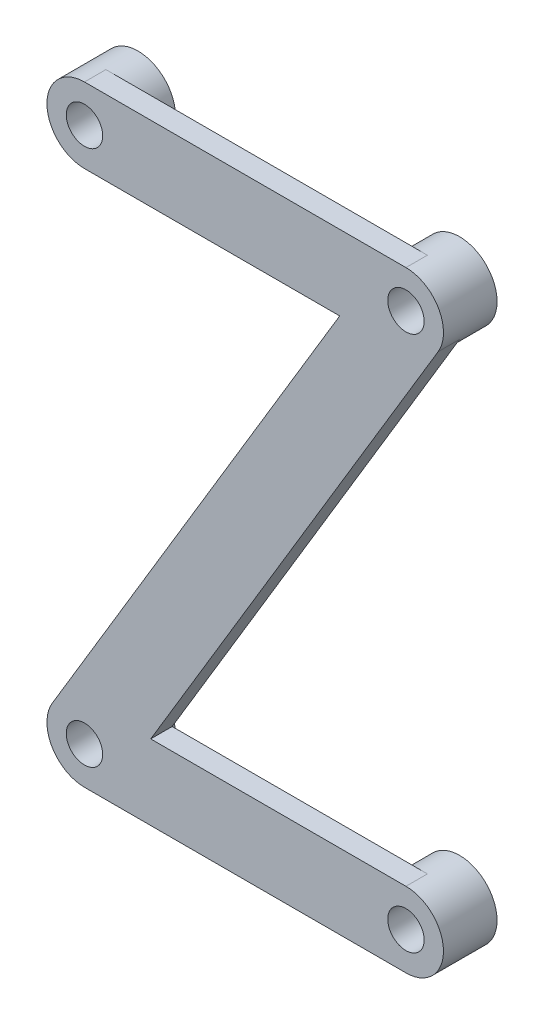
ISO-10303-21;
HEADER;
FILE_DESCRIPTION(('STEP AP214'),'2;1');
FILE_NAME('part.step','',(''),(''),'','','');
FILE_SCHEMA(('AUTOMOTIVE_DESIGN { 1 0 10303 214 1 1 1 1 }'));
ENDSEC;
DATA;
#1=APPLICATION_CONTEXT('core data for automotive mechanical design processes');
#2=APPLICATION_PROTOCOL_DEFINITION('international standard','automotive_design',2000,#1);
#3=PRODUCT_CONTEXT('',#1,'mechanical');
#4=PRODUCT('Part','Part','',(#3));
#5=PRODUCT_RELATED_PRODUCT_CATEGORY('part','',(#4));
#6=PRODUCT_DEFINITION_FORMATION('','',#4);
#7=PRODUCT_DEFINITION_CONTEXT('part definition',#1,'design');
#8=PRODUCT_DEFINITION('design','',#6,#7);
#9=PRODUCT_DEFINITION_SHAPE('','',#8);
#10=(LENGTH_UNIT() NAMED_UNIT(*) SI_UNIT(.MILLI.,.METRE.));
#11=(NAMED_UNIT(*) PLANE_ANGLE_UNIT() SI_UNIT($,.RADIAN.));
#12=(NAMED_UNIT(*) SI_UNIT($,.STERADIAN.) SOLID_ANGLE_UNIT());
#13=UNCERTAINTY_MEASURE_WITH_UNIT(LENGTH_MEASURE(1.E-05),#10,'distance_accuracy_value','');
#14=(GEOMETRIC_REPRESENTATION_CONTEXT(3) GLOBAL_UNCERTAINTY_ASSIGNED_CONTEXT((#13)) GLOBAL_UNIT_ASSIGNED_CONTEXT((#10,
#11,#12)) REPRESENTATION_CONTEXT('',''));
#15=CARTESIAN_POINT('',(0.,0.,0.));
#16=DIRECTION('',(0.,0.,1.));
#17=DIRECTION('',(1.,0.,0.));
#18=AXIS2_PLACEMENT_3D('',#15,#16,#17);
#19=CARTESIAN_POINT('',(0.,28.5,-2.));
#20=DIRECTION('',(0.,-1.,0.));
#21=DIRECTION('',(1.,0.,0.));
#22=AXIS2_PLACEMENT_3D('',#19,#20,#21);
#23=PLANE('',#22);
#24=DIRECTION('',(1.,0.,0.));
#25=VECTOR('',#24,1.);
#26=CARTESIAN_POINT('',(0.,28.5,0.));
#27=LINE('',#26,#25);
#28=CARTESIAN_POINT('',(-15.,28.5,0.));
#29=VERTEX_POINT('',#28);
#30=CARTESIAN_POINT('',(15.,28.5,0.));
#31=VERTEX_POINT('',#30);
#32=EDGE_CURVE('E84',#29,#31,#27,.T.);
#33=ORIENTED_EDGE('',*,*,#32,.T.);
#34=DIRECTION('',(0.,0.,1.));
#35=VECTOR('',#34,1.);
#36=CARTESIAN_POINT('',(15.,28.5,-2.));
#37=LINE('',#36,#35);
#38=CARTESIAN_POINT('',(15.,28.5,-2.));
#39=VERTEX_POINT('',#38);
#40=EDGE_CURVE('E47',#39,#31,#37,.T.);
#41=ORIENTED_EDGE('',*,*,#40,.F.);
#42=DIRECTION('',(1.,0.,0.));
#43=VECTOR('',#42,1.);
#44=CARTESIAN_POINT('',(0.,28.5,-2.));
#45=LINE('',#44,#43);
#46=CARTESIAN_POINT('',(-15.,28.5,-2.));
#47=VERTEX_POINT('',#46);
#48=EDGE_CURVE('E55',#47,#39,#45,.T.);
#49=ORIENTED_EDGE('',*,*,#48,.F.);
#50=DIRECTION('',(0.,0.,1.));
#51=VECTOR('',#50,1.);
#52=CARTESIAN_POINT('',(-15.,28.5,-2.));
#53=LINE('',#52,#51);
#54=EDGE_CURVE('E11',#47,#29,#53,.T.);
#55=ORIENTED_EDGE('',*,*,#54,.T.);
#56=EDGE_LOOP('',(#33,#41,#49,#55));
#57=FACE_BOUND('',#56,.T.);
#58=ADVANCED_FACE('F37',(#57),#23,.F.);
#59=CARTESIAN_POINT('',(3.00122523999391,-1.80073514399634,-2.));
#60=DIRECTION('',(-0.857492925712545,0.514495755427526,0.));
#61=DIRECTION('',(-0.514495755427526,-0.857492925712545,0.));
#62=AXIS2_PLACEMENT_3D('',#59,#60,#61);
#63=PLANE('',#62);
#64=DIRECTION('',(-0.514495755427526,-0.857492925712545,0.));
#65=VECTOR('',#64,1.);
#66=CARTESIAN_POINT('',(3.00122523999391,-1.80073514399634,0.));
#67=LINE('',#66,#65);
#68=CARTESIAN_POINT('',(18.0012252399939,23.1992648560037,0.));
#69=VERTEX_POINT('',#68);
#70=CARTESIAN_POINT('',(-8.81833367360827,-21.5,0.));
#71=VERTEX_POINT('',#70);
#72=EDGE_CURVE('E79',#69,#71,#67,.T.);
#73=ORIENTED_EDGE('',*,*,#72,.T.);
#74=DIRECTION('',(0.,0.,1.));
#75=VECTOR('',#74,1.);
#76=CARTESIAN_POINT('',(-8.81833367360827,-21.5,-2.));
#77=LINE('',#76,#75);
#78=CARTESIAN_POINT('',(-8.81833367360827,-21.5,-2.));
#79=VERTEX_POINT('',#78);
#80=EDGE_CURVE('E126',#79,#71,#77,.T.);
#81=ORIENTED_EDGE('',*,*,#80,.F.);
#82=DIRECTION('',(-0.514495755427526,-0.857492925712545,0.));
#83=VECTOR('',#82,1.);
#84=CARTESIAN_POINT('',(3.00122523999391,-1.80073514399634,-2.));
#85=LINE('',#84,#83);
#86=CARTESIAN_POINT('',(18.0012252399939,23.1992648560037,-2.));
#87=VERTEX_POINT('',#86);
#88=EDGE_CURVE('E118',#87,#79,#85,.T.);
#89=ORIENTED_EDGE('',*,*,#88,.F.);
#90=DIRECTION('',(0.,0.,1.));
#91=VECTOR('',#90,1.);
#92=CARTESIAN_POINT('',(18.0012252399939,23.1992648560037,-2.));
#93=LINE('',#92,#91);
#94=EDGE_CURVE('E124',#87,#69,#93,.T.);
#95=ORIENTED_EDGE('',*,*,#94,.T.);
#96=EDGE_LOOP('',(#73,#81,#89,#95));
#97=FACE_BOUND('',#96,.T.);
#98=ADVANCED_FACE('F122',(#97),#63,.F.);
#99=CARTESIAN_POINT('',(0.,-21.5,-2.));
#100=DIRECTION('',(0.,-1.,0.));
#101=DIRECTION('',(0.,0.,-1.));
#102=AXIS2_PLACEMENT_3D('',#99,#100,#101);
#103=PLANE('',#102);
#104=DIRECTION('',(1.,0.,0.));
#105=VECTOR('',#104,1.);
#106=CARTESIAN_POINT('',(0.,-21.5,0.));
#107=LINE('',#106,#105);
#108=CARTESIAN_POINT('',(15.,-21.5,0.));
#109=VERTEX_POINT('',#108);
#110=EDGE_CURVE('E167',#71,#109,#107,.T.);
#111=ORIENTED_EDGE('',*,*,#110,.T.);
#112=DIRECTION('',(0.,0.,1.));
#113=VECTOR('',#112,1.);
#114=CARTESIAN_POINT('',(15.,-21.5,-2.));
#115=LINE('',#114,#113);
#116=CARTESIAN_POINT('',(15.,-21.5,-2.));
#117=VERTEX_POINT('',#116);
#118=EDGE_CURVE('E136',#117,#109,#115,.T.);
#119=ORIENTED_EDGE('',*,*,#118,.F.);
#120=DIRECTION('',(1.,0.,0.));
#121=VECTOR('',#120,1.);
#122=CARTESIAN_POINT('',(0.,-21.5,-2.));
#123=LINE('',#122,#121);
#124=EDGE_CURVE('E128',#79,#117,#123,.T.);
#125=ORIENTED_EDGE('',*,*,#124,.F.);
#126=ORIENTED_EDGE('',*,*,#80,.T.);
#127=EDGE_LOOP('',(#111,#119,#125,#126));
#128=FACE_BOUND('',#127,.T.);
#129=ADVANCED_FACE('F193',(#128),#103,.F.);
#130=CARTESIAN_POINT('',(0.,-28.5,-2.));
#131=DIRECTION('',(0.,-1.,0.));
#132=DIRECTION('',(0.,0.,-1.));
#133=AXIS2_PLACEMENT_3D('',#130,#131,#132);
#134=PLANE('',#133);
#135=DIRECTION('',(1.,0.,0.));
#136=VECTOR('',#135,1.);
#137=CARTESIAN_POINT('',(0.,-28.5,0.));
#138=LINE('',#137,#136);
#139=CARTESIAN_POINT('',(-15.,-28.5,0.));
#140=VERTEX_POINT('',#139);
#141=CARTESIAN_POINT('',(15.,-28.5,0.));
#142=VERTEX_POINT('',#141);
#143=EDGE_CURVE('E164',#140,#142,#138,.T.);
#144=ORIENTED_EDGE('',*,*,#143,.F.);
#145=DIRECTION('',(0.,0.,1.));
#146=VECTOR('',#145,1.);
#147=CARTESIAN_POINT('',(-15.,-28.5,-2.));
#148=LINE('',#147,#146);
#149=CARTESIAN_POINT('',(-15.,-28.5,-2.));
#150=VERTEX_POINT('',#149);
#151=EDGE_CURVE('E144',#150,#140,#148,.T.);
#152=ORIENTED_EDGE('',*,*,#151,.F.);
#153=DIRECTION('',(1.,0.,0.));
#154=VECTOR('',#153,1.);
#155=CARTESIAN_POINT('',(0.,-28.5,-2.));
#156=LINE('',#155,#154);
#157=CARTESIAN_POINT('',(15.,-28.5,-2.));
#158=VERTEX_POINT('',#157);
#159=EDGE_CURVE('E184',#150,#158,#156,.T.);
#160=ORIENTED_EDGE('',*,*,#159,.T.);
#161=DIRECTION('',(0.,0.,1.));
#162=VECTOR('',#161,1.);
#163=CARTESIAN_POINT('',(15.,-28.5,-2.));
#164=LINE('',#163,#162);
#165=EDGE_CURVE('E141',#158,#142,#164,.T.);
#166=ORIENTED_EDGE('',*,*,#165,.T.);
#167=EDGE_LOOP('',(#144,#152,#160,#166));
#168=FACE_BOUND('',#167,.T.);
#169=ADVANCED_FACE('F204',(#168),#134,.T.);
#170=CARTESIAN_POINT('',(-3.00122523999392,1.80073514399635,-2.));
#171=DIRECTION('',(-0.857492925712544,0.514495755427526,0.));
#172=DIRECTION('',(-0.514495755427526,-0.857492925712544,0.));
#173=AXIS2_PLACEMENT_3D('',#170,#171,#172);
#174=PLANE('',#173);
#175=DIRECTION('',(-0.514495755427526,-0.857492925712544,0.));
#176=VECTOR('',#175,1.);
#177=CARTESIAN_POINT('',(-3.00122523999392,1.80073514399635,0.));
#178=LINE('',#177,#176);
#179=CARTESIAN_POINT('',(8.81833367360827,21.5,0.));
#180=VERTEX_POINT('',#179);
#181=CARTESIAN_POINT('',(-18.0012252399939,-23.1992648560037,0.));
#182=VERTEX_POINT('',#181);
#183=EDGE_CURVE('E160',#180,#182,#178,.T.);
#184=ORIENTED_EDGE('',*,*,#183,.F.);
#185=DIRECTION('',(0.,0.,1.));
#186=VECTOR('',#185,1.);
#187=CARTESIAN_POINT('',(8.81833367360827,21.5,-2.));
#188=LINE('',#187,#186);
#189=CARTESIAN_POINT('',(8.81833367360827,21.5,-2.));
#190=VERTEX_POINT('',#189);
#191=EDGE_CURVE('E149',#190,#180,#188,.T.);
#192=ORIENTED_EDGE('',*,*,#191,.F.);
#193=DIRECTION('',(-0.514495755427526,-0.857492925712544,0.));
#194=VECTOR('',#193,1.);
#195=CARTESIAN_POINT('',(-3.00122523999392,1.80073514399635,-2.));
#196=LINE('',#195,#194);
#197=CARTESIAN_POINT('',(-18.0012252399939,-23.1992648560036,-2.));
#198=VERTEX_POINT('',#197);
#199=EDGE_CURVE('E174',#190,#198,#196,.T.);
#200=ORIENTED_EDGE('',*,*,#199,.T.);
#201=DIRECTION('',(0.,0.,1.));
#202=VECTOR('',#201,1.);
#203=CARTESIAN_POINT('',(-18.0012252399939,-23.1992648560036,-2.));
#204=LINE('',#203,#202);
#205=EDGE_CURVE('E147',#198,#182,#204,.T.);
#206=ORIENTED_EDGE('',*,*,#205,.T.);
#207=EDGE_LOOP('',(#184,#192,#200,#206));
#208=FACE_BOUND('',#207,.T.);
#209=ADVANCED_FACE('F285',(#208),#174,.T.);
#210=CARTESIAN_POINT('',(0.,21.5,-2.));
#211=DIRECTION('',(0.,-1.,0.));
#212=DIRECTION('',(1.,0.,0.));
#213=AXIS2_PLACEMENT_3D('',#210,#211,#212);
#214=PLANE('',#213);
#215=DIRECTION('',(1.,0.,0.));
#216=VECTOR('',#215,1.);
#217=CARTESIAN_POINT('',(0.,21.5,0.));
#218=LINE('',#217,#216);
#219=CARTESIAN_POINT('',(-15.,21.5,0.));
#220=VERTEX_POINT('',#219);
#221=EDGE_CURVE('E157',#220,#180,#218,.T.);
#222=ORIENTED_EDGE('',*,*,#221,.F.);
#223=DIRECTION('',(0.,0.,1.));
#224=VECTOR('',#223,1.);
#225=CARTESIAN_POINT('',(-15.,21.5,-2.));
#226=LINE('',#225,#224);
#227=CARTESIAN_POINT('',(-15.,21.5,-2.));
#228=VERTEX_POINT('',#227);
#229=EDGE_CURVE('E41',#228,#220,#226,.T.);
#230=ORIENTED_EDGE('',*,*,#229,.F.);
#231=DIRECTION('',(1.,0.,0.));
#232=VECTOR('',#231,1.);
#233=CARTESIAN_POINT('',(0.,21.5,-2.));
#234=LINE('',#233,#232);
#235=EDGE_CURVE('E171',#228,#190,#234,.T.);
#236=ORIENTED_EDGE('',*,*,#235,.T.);
#237=ORIENTED_EDGE('',*,*,#191,.T.);
#238=EDGE_LOOP('',(#222,#230,#236,#237));
#239=FACE_BOUND('',#238,.T.);
#240=ADVANCED_FACE('F39',(#239),#214,.T.);
#241=CARTESIAN_POINT('',(0.,0.,-2.));
#242=DIRECTION('',(0.,0.,1.));
#243=DIRECTION('',(1.,0.,0.));
#244=AXIS2_PLACEMENT_3D('',#241,#242,#243);
#245=PLANE('',#244);
#246=CARTESIAN_POINT('',(-15.,25.,-2.));
#247=DIRECTION('',(0.,0.,1.));
#248=DIRECTION('',(1.,0.,0.));
#249=AXIS2_PLACEMENT_3D('',#246,#247,#248);
#250=CIRCLE('',#249,3.5);
#251=EDGE_CURVE('E170',#228,#47,#250,.T.);
#252=ORIENTED_EDGE('',*,*,#251,.T.);
#253=ORIENTED_EDGE('',*,*,#48,.T.);
#254=CARTESIAN_POINT('',(15.,25.,-2.));
#255=DIRECTION('',(0.,0.,1.));
#256=DIRECTION('',(1.,0.,0.));
#257=AXIS2_PLACEMENT_3D('',#254,#255,#256);
#258=CIRCLE('',#257,3.50000000000001);
#259=EDGE_CURVE('E115',#39,#87,#258,.T.);
#260=ORIENTED_EDGE('',*,*,#259,.T.);
#261=ORIENTED_EDGE('',*,*,#88,.T.);
#262=ORIENTED_EDGE('',*,*,#124,.T.);
#263=CARTESIAN_POINT('',(15.,-25.,-2.));
#264=DIRECTION('',(0.,0.,1.));
#265=DIRECTION('',(1.,0.,0.));
#266=AXIS2_PLACEMENT_3D('',#263,#264,#265);
#267=CIRCLE('',#266,3.49999999999999);
#268=EDGE_CURVE('E187',#117,#158,#267,.T.);
#269=ORIENTED_EDGE('',*,*,#268,.T.);
#270=ORIENTED_EDGE('',*,*,#159,.F.);
#271=CARTESIAN_POINT('',(-15.,-25.,-2.));
#272=DIRECTION('',(0.,0.,1.));
#273=DIRECTION('',(1.,0.,0.));
#274=AXIS2_PLACEMENT_3D('',#271,#272,#273);
#275=CIRCLE('',#274,3.5);
#276=EDGE_CURVE('E182',#150,#198,#275,.T.);
#277=ORIENTED_EDGE('',*,*,#276,.T.);
#278=ORIENTED_EDGE('',*,*,#199,.F.);
#279=ORIENTED_EDGE('',*,*,#235,.F.);
#280=EDGE_LOOP('',(#252,#253,#260,#261,#262,#269,#270,#277,#278,#279));
#281=FACE_BOUND('',#280,.T.);
#282=ADVANCED_FACE('F117',(#281),#245,.F.);
#283=CARTESIAN_POINT('',(0.,0.,0.));
#284=DIRECTION('',(0.,0.,1.));
#285=DIRECTION('',(1.,0.,0.));
#286=AXIS2_PLACEMENT_3D('',#283,#284,#285);
#287=PLANE('',#286);
#288=ORIENTED_EDGE('',*,*,#32,.F.);
#289=CARTESIAN_POINT('',(-15.,25.,0.));
#290=DIRECTION('',(0.,0.,1.));
#291=DIRECTION('',(1.,0.,0.));
#292=AXIS2_PLACEMENT_3D('',#289,#290,#291);
#293=CIRCLE('',#292,3.5);
#294=EDGE_CURVE('E177',#29,#220,#293,.T.);
#295=ORIENTED_EDGE('',*,*,#294,.T.);
#296=ORIENTED_EDGE('',*,*,#221,.T.);
#297=ORIENTED_EDGE('',*,*,#183,.T.);
#298=CARTESIAN_POINT('',(-15.,-25.,0.));
#299=DIRECTION('',(0.,0.,1.));
#300=DIRECTION('',(1.,0.,0.));
#301=AXIS2_PLACEMENT_3D('',#298,#299,#300);
#302=CIRCLE('',#301,3.5);
#303=EDGE_CURVE('E234',#182,#140,#302,.T.);
#304=ORIENTED_EDGE('',*,*,#303,.T.);
#305=ORIENTED_EDGE('',*,*,#143,.T.);
#306=CARTESIAN_POINT('',(15.,-25.,0.));
#307=DIRECTION('',(0.,0.,1.));
#308=DIRECTION('',(1.,0.,0.));
#309=AXIS2_PLACEMENT_3D('',#306,#307,#308);
#310=CIRCLE('',#309,3.49999999999999);
#311=EDGE_CURVE('E202',#142,#109,#310,.T.);
#312=ORIENTED_EDGE('',*,*,#311,.T.);
#313=ORIENTED_EDGE('',*,*,#110,.F.);
#314=ORIENTED_EDGE('',*,*,#72,.F.);
#315=CARTESIAN_POINT('',(15.,25.,0.));
#316=DIRECTION('',(0.,0.,1.));
#317=DIRECTION('',(1.,0.,0.));
#318=AXIS2_PLACEMENT_3D('',#315,#316,#317);
#319=CIRCLE('',#318,3.50000000000001);
#320=EDGE_CURVE('E133',#69,#31,#319,.T.);
#321=ORIENTED_EDGE('',*,*,#320,.T.);
#322=EDGE_LOOP('',(#288,#295,#296,#297,#304,#305,#312,#313,#314,#321));
#323=FACE_BOUND('',#322,.T.);
#324=CARTESIAN_POINT('',(-15.,25.,0.));
#325=DIRECTION('',(0.,0.,1.));
#326=DIRECTION('',(1.,0.,0.));
#327=AXIS2_PLACEMENT_3D('',#324,#325,#326);
#328=CIRCLE('',#327,1.7);
#329=CARTESIAN_POINT('',(-13.3,25.,0.));
#330=VERTEX_POINT('',#329);
#331=EDGE_CURVE('E214',#330,#330,#328,.T.);
#332=ORIENTED_EDGE('',*,*,#331,.F.);
#333=EDGE_LOOP('',(#332));
#334=FACE_BOUND('',#333,.T.);
#335=CARTESIAN_POINT('',(15.,25.,0.));
#336=DIRECTION('',(0.,0.,1.));
#337=DIRECTION('',(1.,0.,0.));
#338=AXIS2_PLACEMENT_3D('',#335,#336,#337);
#339=CIRCLE('',#338,1.7);
#340=CARTESIAN_POINT('',(16.7,25.,0.));
#341=VERTEX_POINT('',#340);
#342=EDGE_CURVE('E228',#341,#341,#339,.T.);
#343=ORIENTED_EDGE('',*,*,#342,.F.);
#344=EDGE_LOOP('',(#343));
#345=FACE_BOUND('',#344,.T.);
#346=CARTESIAN_POINT('',(-15.,-25.,0.));
#347=DIRECTION('',(0.,0.,1.));
#348=DIRECTION('',(1.,0.,0.));
#349=AXIS2_PLACEMENT_3D('',#346,#347,#348);
#350=CIRCLE('',#349,1.7);
#351=CARTESIAN_POINT('',(-13.3,-25.,0.));
#352=VERTEX_POINT('',#351);
#353=EDGE_CURVE('E237',#352,#352,#350,.T.);
#354=ORIENTED_EDGE('',*,*,#353,.F.);
#355=EDGE_LOOP('',(#354));
#356=FACE_BOUND('',#355,.T.);
#357=CARTESIAN_POINT('',(15.,-25.,0.));
#358=DIRECTION('',(0.,0.,1.));
#359=DIRECTION('',(1.,0.,0.));
#360=AXIS2_PLACEMENT_3D('',#357,#358,#359);
#361=CIRCLE('',#360,1.7);
#362=CARTESIAN_POINT('',(16.7,-25.,0.));
#363=VERTEX_POINT('',#362);
#364=EDGE_CURVE('E247',#363,#363,#361,.T.);
#365=ORIENTED_EDGE('',*,*,#364,.F.);
#366=EDGE_LOOP('',(#365));
#367=FACE_BOUND('',#366,.T.);
#368=ADVANCED_FACE('F210',(#323,#334,#345,#356,#367),#287,.T.);
#369=CARTESIAN_POINT('',(-15.,25.,-5.));
#370=DIRECTION('',(0.,0.,1.));
#371=DIRECTION('',(1.,0.,0.));
#372=AXIS2_PLACEMENT_3D('',#369,#370,#371);
#373=CYLINDRICAL_SURFACE('',#372,3.5);
#374=CARTESIAN_POINT('',(-15.,25.,-5.));
#375=DIRECTION('',(0.,0.,1.));
#376=DIRECTION('',(1.,0.,0.));
#377=AXIS2_PLACEMENT_3D('',#374,#375,#376);
#378=CIRCLE('',#377,3.5);
#379=CARTESIAN_POINT('',(-11.5,25.,-5.));
#380=VERTEX_POINT('',#379);
#381=EDGE_CURVE('E161',#380,#380,#378,.T.);
#382=ORIENTED_EDGE('',*,*,#381,.T.);
#383=EDGE_LOOP('',(#382));
#384=FACE_BOUND('',#383,.T.);
#385=ORIENTED_EDGE('',*,*,#54,.F.);
#386=ORIENTED_EDGE('',*,*,#251,.F.);
#387=ORIENTED_EDGE('',*,*,#229,.T.);
#388=ORIENTED_EDGE('',*,*,#294,.F.);
#389=EDGE_LOOP('',(#385,#386,#387,#388));
#390=FACE_BOUND('',#389,.T.);
#391=ADVANCED_FACE('F212',(#384,#390),#373,.T.);
#392=CARTESIAN_POINT('',(-15.,25.,-5.));
#393=DIRECTION('',(0.,0.,1.));
#394=DIRECTION('',(1.,0.,0.));
#395=AXIS2_PLACEMENT_3D('',#392,#393,#394);
#396=CYLINDRICAL_SURFACE('',#395,1.7);
#397=CARTESIAN_POINT('',(-15.,25.,-5.));
#398=DIRECTION('',(0.,0.,1.));
#399=DIRECTION('',(1.,0.,0.));
#400=AXIS2_PLACEMENT_3D('',#397,#398,#399);
#401=CIRCLE('',#400,1.7);
#402=CARTESIAN_POINT('',(-13.3,25.,-5.));
#403=VERTEX_POINT('',#402);
#404=EDGE_CURVE('E213',#403,#403,#401,.T.);
#405=ORIENTED_EDGE('',*,*,#404,.F.);
#406=EDGE_LOOP('',(#405));
#407=FACE_BOUND('',#406,.T.);
#408=ORIENTED_EDGE('',*,*,#331,.T.);
#409=EDGE_LOOP('',(#408));
#410=FACE_BOUND('',#409,.T.);
#411=ADVANCED_FACE('F271',(#407,#410),#396,.F.);
#412=CARTESIAN_POINT('',(0.,0.,-5.));
#413=DIRECTION('',(0.,0.,1.));
#414=DIRECTION('',(1.,0.,0.));
#415=AXIS2_PLACEMENT_3D('',#412,#413,#414);
#416=PLANE('',#415);
#417=ORIENTED_EDGE('',*,*,#404,.T.);
#418=EDGE_LOOP('',(#417));
#419=FACE_BOUND('',#418,.T.);
#420=ORIENTED_EDGE('',*,*,#381,.F.);
#421=EDGE_LOOP('',(#420));
#422=FACE_BOUND('',#421,.T.);
#423=ADVANCED_FACE('F322',(#419,#422),#416,.F.);
#424=CARTESIAN_POINT('',(15.,25.,-5.));
#425=DIRECTION('',(0.,0.,1.));
#426=DIRECTION('',(1.,0.,0.));
#427=AXIS2_PLACEMENT_3D('',#424,#425,#426);
#428=CYLINDRICAL_SURFACE('',#427,1.7);
#429=CARTESIAN_POINT('',(15.,25.,-5.));
#430=DIRECTION('',(0.,0.,1.));
#431=DIRECTION('',(1.,0.,0.));
#432=AXIS2_PLACEMENT_3D('',#429,#430,#431);
#433=CIRCLE('',#432,1.7);
#434=CARTESIAN_POINT('',(16.7,25.,-5.));
#435=VERTEX_POINT('',#434);
#436=EDGE_CURVE('E222',#435,#435,#433,.T.);
#437=ORIENTED_EDGE('',*,*,#436,.F.);
#438=EDGE_LOOP('',(#437));
#439=FACE_BOUND('',#438,.T.);
#440=ORIENTED_EDGE('',*,*,#342,.T.);
#441=EDGE_LOOP('',(#440));
#442=FACE_BOUND('',#441,.T.);
#443=ADVANCED_FACE('F319',(#439,#442),#428,.F.);
#444=CARTESIAN_POINT('',(15.,25.,-5.));
#445=DIRECTION('',(0.,0.,1.));
#446=DIRECTION('',(1.,0.,0.));
#447=AXIS2_PLACEMENT_3D('',#444,#445,#446);
#448=CYLINDRICAL_SURFACE('',#447,3.50000000000001);
#449=ORIENTED_EDGE('',*,*,#259,.F.);
#450=ORIENTED_EDGE('',*,*,#40,.T.);
#451=ORIENTED_EDGE('',*,*,#320,.F.);
#452=ORIENTED_EDGE('',*,*,#94,.F.);
#453=EDGE_LOOP('',(#449,#450,#451,#452));
#454=FACE_BOUND('',#453,.T.);
#455=CARTESIAN_POINT('',(15.,25.,-5.));
#456=DIRECTION('',(0.,0.,1.));
#457=DIRECTION('',(1.,0.,0.));
#458=AXIS2_PLACEMENT_3D('',#455,#456,#457);
#459=CIRCLE('',#458,3.50000000000001);
#460=CARTESIAN_POINT('',(18.5,25.,-5.));
#461=VERTEX_POINT('',#460);
#462=EDGE_CURVE('E218',#461,#461,#459,.T.);
#463=ORIENTED_EDGE('',*,*,#462,.T.);
#464=EDGE_LOOP('',(#463));
#465=FACE_BOUND('',#464,.T.);
#466=ADVANCED_FACE('F130',(#454,#465),#448,.T.);
#467=CARTESIAN_POINT('',(0.,0.,-5.));
#468=DIRECTION('',(0.,0.,1.));
#469=DIRECTION('',(1.,0.,0.));
#470=AXIS2_PLACEMENT_3D('',#467,#468,#469);
#471=PLANE('',#470);
#472=ORIENTED_EDGE('',*,*,#436,.T.);
#473=EDGE_LOOP('',(#472));
#474=FACE_BOUND('',#473,.T.);
#475=ORIENTED_EDGE('',*,*,#462,.F.);
#476=EDGE_LOOP('',(#475));
#477=FACE_BOUND('',#476,.T.);
#478=ADVANCED_FACE('F312',(#474,#477),#471,.F.);
#479=CARTESIAN_POINT('',(-15.,-25.,-5.));
#480=DIRECTION('',(0.,0.,1.));
#481=DIRECTION('',(1.,0.,0.));
#482=AXIS2_PLACEMENT_3D('',#479,#480,#481);
#483=CYLINDRICAL_SURFACE('',#482,1.7);
#484=CARTESIAN_POINT('',(-15.,-25.,-5.));
#485=DIRECTION('',(0.,0.,1.));
#486=DIRECTION('',(1.,0.,0.));
#487=AXIS2_PLACEMENT_3D('',#484,#485,#486);
#488=CIRCLE('',#487,1.7);
#489=CARTESIAN_POINT('',(-13.3,-25.,-5.));
#490=VERTEX_POINT('',#489);
#491=EDGE_CURVE('E236',#490,#490,#488,.T.);
#492=ORIENTED_EDGE('',*,*,#491,.F.);
#493=EDGE_LOOP('',(#492));
#494=FACE_BOUND('',#493,.T.);
#495=ORIENTED_EDGE('',*,*,#353,.T.);
#496=EDGE_LOOP('',(#495));
#497=FACE_BOUND('',#496,.T.);
#498=ADVANCED_FACE('F299',(#494,#497),#483,.F.);
#499=CARTESIAN_POINT('',(-15.,-25.,-5.));
#500=DIRECTION('',(0.,0.,1.));
#501=DIRECTION('',(1.,0.,0.));
#502=AXIS2_PLACEMENT_3D('',#499,#500,#501);
#503=CYLINDRICAL_SURFACE('',#502,3.5);
#504=ORIENTED_EDGE('',*,*,#276,.F.);
#505=ORIENTED_EDGE('',*,*,#151,.T.);
#506=ORIENTED_EDGE('',*,*,#303,.F.);
#507=ORIENTED_EDGE('',*,*,#205,.F.);
#508=EDGE_LOOP('',(#504,#505,#506,#507));
#509=FACE_BOUND('',#508,.T.);
#510=CARTESIAN_POINT('',(-15.,-25.,-5.));
#511=DIRECTION('',(0.,0.,1.));
#512=DIRECTION('',(1.,0.,0.));
#513=AXIS2_PLACEMENT_3D('',#510,#511,#512);
#514=CIRCLE('',#513,3.5);
#515=CARTESIAN_POINT('',(-11.5,-25.,-5.));
#516=VERTEX_POINT('',#515);
#517=EDGE_CURVE('E230',#516,#516,#514,.T.);
#518=ORIENTED_EDGE('',*,*,#517,.T.);
#519=EDGE_LOOP('',(#518));
#520=FACE_BOUND('',#519,.T.);
#521=ADVANCED_FACE('F296',(#509,#520),#503,.T.);
#522=CARTESIAN_POINT('',(0.,0.,-5.));
#523=DIRECTION('',(0.,0.,1.));
#524=DIRECTION('',(1.,0.,0.));
#525=AXIS2_PLACEMENT_3D('',#522,#523,#524);
#526=PLANE('',#525);
#527=ORIENTED_EDGE('',*,*,#491,.T.);
#528=EDGE_LOOP('',(#527));
#529=FACE_BOUND('',#528,.T.);
#530=ORIENTED_EDGE('',*,*,#517,.F.);
#531=EDGE_LOOP('',(#530));
#532=FACE_BOUND('',#531,.T.);
#533=ADVANCED_FACE('F261',(#529,#532),#526,.F.);
#534=CARTESIAN_POINT('',(15.,-25.,-5.));
#535=DIRECTION('',(0.,0.,1.));
#536=DIRECTION('',(1.,0.,0.));
#537=AXIS2_PLACEMENT_3D('',#534,#535,#536);
#538=CYLINDRICAL_SURFACE('',#537,1.7);
#539=CARTESIAN_POINT('',(15.,-25.,-5.));
#540=DIRECTION('',(0.,0.,1.));
#541=DIRECTION('',(1.,0.,0.));
#542=AXIS2_PLACEMENT_3D('',#539,#540,#541);
#543=CIRCLE('',#542,1.7);
#544=CARTESIAN_POINT('',(16.7,-25.,-5.));
#545=VERTEX_POINT('',#544);
#546=EDGE_CURVE('E246',#545,#545,#543,.T.);
#547=ORIENTED_EDGE('',*,*,#546,.F.);
#548=EDGE_LOOP('',(#547));
#549=FACE_BOUND('',#548,.T.);
#550=ORIENTED_EDGE('',*,*,#364,.T.);
#551=EDGE_LOOP('',(#550));
#552=FACE_BOUND('',#551,.T.);
#553=ADVANCED_FACE('F258',(#549,#552),#538,.F.);
#554=CARTESIAN_POINT('',(15.,-25.,-5.));
#555=DIRECTION('',(0.,0.,1.));
#556=DIRECTION('',(1.,0.,0.));
#557=AXIS2_PLACEMENT_3D('',#554,#555,#556);
#558=CYLINDRICAL_SURFACE('',#557,3.49999999999999);
#559=ORIENTED_EDGE('',*,*,#268,.F.);
#560=ORIENTED_EDGE('',*,*,#118,.T.);
#561=ORIENTED_EDGE('',*,*,#311,.F.);
#562=ORIENTED_EDGE('',*,*,#165,.F.);
#563=EDGE_LOOP('',(#559,#560,#561,#562));
#564=FACE_BOUND('',#563,.T.);
#565=CARTESIAN_POINT('',(15.,-25.,-5.));
#566=DIRECTION('',(0.,0.,1.));
#567=DIRECTION('',(1.,0.,0.));
#568=AXIS2_PLACEMENT_3D('',#565,#566,#567);
#569=CIRCLE('',#568,3.49999999999999);
#570=CARTESIAN_POINT('',(18.5,-25.,-5.));
#571=VERTEX_POINT('',#570);
#572=EDGE_CURVE('E240',#571,#571,#569,.T.);
#573=ORIENTED_EDGE('',*,*,#572,.T.);
#574=EDGE_LOOP('',(#573));
#575=FACE_BOUND('',#574,.T.);
#576=ADVANCED_FACE('F199',(#564,#575),#558,.T.);
#577=CARTESIAN_POINT('',(0.,0.,-5.));
#578=DIRECTION('',(0.,0.,1.));
#579=DIRECTION('',(1.,0.,0.));
#580=AXIS2_PLACEMENT_3D('',#577,#578,#579);
#581=PLANE('',#580);
#582=ORIENTED_EDGE('',*,*,#546,.T.);
#583=EDGE_LOOP('',(#582));
#584=FACE_BOUND('',#583,.T.);
#585=ORIENTED_EDGE('',*,*,#572,.F.);
#586=EDGE_LOOP('',(#585));
#587=FACE_BOUND('',#586,.T.);
#588=ADVANCED_FACE('F255',(#584,#587),#581,.F.);
#589=CLOSED_SHELL('',(#58,#98,#129,#169,#209,#240,#282,#368,#391,#411,#423,#443,#466,#478,#498,
#521,#533,#553,#576,#588));
#590=MANIFOLD_SOLID_BREP('B2',#589);
#591=ADVANCED_BREP_SHAPE_REPRESENTATION('',(#18,#590),#14);
#592=SHAPE_DEFINITION_REPRESENTATION(#9,#591);
ENDSEC;
END-ISO-10303-21;
